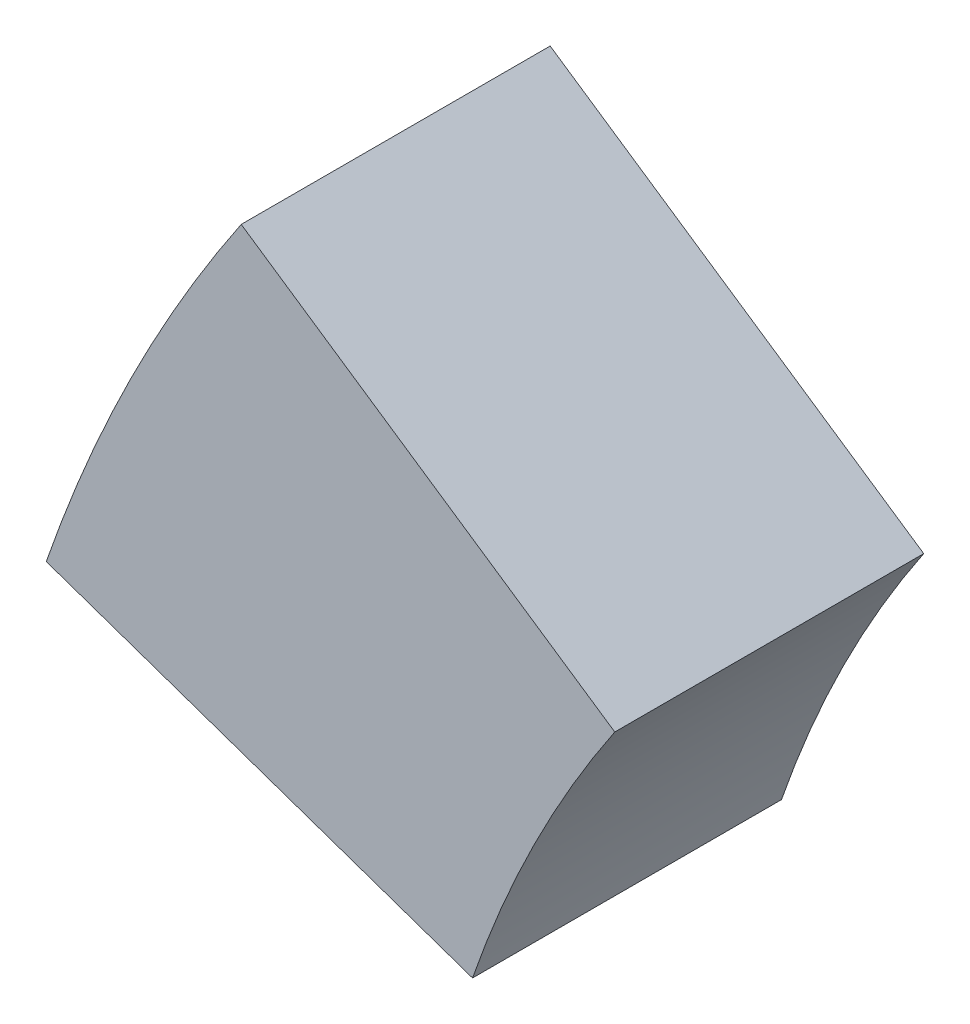
ISO-10303-21;
HEADER;
FILE_DESCRIPTION(('STEP AP214'),'2;1');
FILE_NAME('part.step','',(''),(''),'','','');
FILE_SCHEMA(('AUTOMOTIVE_DESIGN { 1 0 10303 214 1 1 1 1 }'));
ENDSEC;
DATA;
#1=APPLICATION_CONTEXT('core data for automotive mechanical design processes');
#2=APPLICATION_PROTOCOL_DEFINITION('international standard','automotive_design',2000,#1);
#3=PRODUCT_CONTEXT('',#1,'mechanical');
#4=PRODUCT('Part','Part','',(#3));
#5=PRODUCT_RELATED_PRODUCT_CATEGORY('part','',(#4));
#6=PRODUCT_DEFINITION_FORMATION('','',#4);
#7=PRODUCT_DEFINITION_CONTEXT('part definition',#1,'design');
#8=PRODUCT_DEFINITION('design','',#6,#7);
#9=PRODUCT_DEFINITION_SHAPE('','',#8);
#10=(LENGTH_UNIT() NAMED_UNIT(*) SI_UNIT(.MILLI.,.METRE.));
#11=(NAMED_UNIT(*) PLANE_ANGLE_UNIT() SI_UNIT($,.RADIAN.));
#12=(NAMED_UNIT(*) SI_UNIT($,.STERADIAN.) SOLID_ANGLE_UNIT());
#13=UNCERTAINTY_MEASURE_WITH_UNIT(LENGTH_MEASURE(1.E-05),#10,'distance_accuracy_value','');
#14=(GEOMETRIC_REPRESENTATION_CONTEXT(3) GLOBAL_UNCERTAINTY_ASSIGNED_CONTEXT((#13)) GLOBAL_UNIT_ASSIGNED_CONTEXT((#10,
#11,#12)) REPRESENTATION_CONTEXT('',''));
#15=CARTESIAN_POINT('',(0.,0.,0.));
#16=DIRECTION('',(0.,0.,1.));
#17=DIRECTION('',(1.,0.,0.));
#18=AXIS2_PLACEMENT_3D('',#15,#16,#17);
#19=CARTESIAN_POINT('',(0.,0.,50.));
#20=DIRECTION('',(0.,0.,-1.));
#21=DIRECTION('',(-1.,0.,0.));
#22=AXIS2_PLACEMENT_3D('',#19,#20,#21);
#23=CYLINDRICAL_SURFACE('',#22,197.);
#24=CARTESIAN_POINT('',(0.,0.,0.));
#25=DIRECTION('',(0.,0.,-1.));
#26=DIRECTION('',(-1.,0.,0.));
#27=AXIS2_PLACEMENT_3D('',#24,#25,#26);
#28=CIRCLE('',#27,197.);
#29=CARTESIAN_POINT('',(-186.166684544088,64.4279874422743,0.));
#30=VERTEX_POINT('',#29);
#31=CARTESIAN_POINT('',(-163.148018408058,110.416140529924,0.));
#32=VERTEX_POINT('',#31);
#33=EDGE_CURVE('E96',#30,#32,#28,.T.);
#34=ORIENTED_EDGE('',*,*,#33,.T.);
#35=DIRECTION('',(0.,0.,-1.));
#36=VECTOR('',#35,1.);
#37=CARTESIAN_POINT('',(-163.148018408058,110.416140529924,50.));
#38=LINE('',#37,#36);
#39=CARTESIAN_POINT('',(-163.148018408058,110.416140529924,50.));
#40=VERTEX_POINT('',#39);
#41=EDGE_CURVE('E11',#40,#32,#38,.T.);
#42=ORIENTED_EDGE('',*,*,#41,.F.);
#43=CARTESIAN_POINT('',(0.,0.,50.));
#44=DIRECTION('',(0.,0.,-1.));
#45=DIRECTION('',(-1.,0.,0.));
#46=AXIS2_PLACEMENT_3D('',#43,#44,#45);
#47=CIRCLE('',#46,197.);
#48=CARTESIAN_POINT('',(-186.166684544088,64.4279874422743,50.));
#49=VERTEX_POINT('',#48);
#50=EDGE_CURVE('E84',#49,#40,#47,.T.);
#51=ORIENTED_EDGE('',*,*,#50,.F.);
#52=DIRECTION('',(0.,0.,-1.));
#53=VECTOR('',#52,1.);
#54=CARTESIAN_POINT('',(-186.166684544088,64.4279874422743,50.));
#55=LINE('',#54,#53);
#56=EDGE_CURVE('E92',#49,#30,#55,.T.);
#57=ORIENTED_EDGE('',*,*,#56,.T.);
#58=EDGE_LOOP('',(#34,#42,#51,#57));
#59=FACE_BOUND('',#58,.T.);
#60=ADVANCED_FACE('F33',(#59),#23,.F.);
#61=CARTESIAN_POINT('',(-223.603883097339,151.331766208525,50.));
#62=DIRECTION('',(-0.560488022994537,-0.828162529990144,0.));
#63=DIRECTION('',(0.828162529990144,-0.560488022994537,0.));
#64=AXIS2_PLACEMENT_3D('',#61,#62,#63);
#65=PLANE('',#64);
#66=DIRECTION('',(-0.828162529990144,0.560488022994537,0.));
#67=VECTOR('',#66,1.);
#68=CARTESIAN_POINT('',(-223.603883097339,151.331766208525,0.));
#69=LINE('',#68,#67);
#70=CARTESIAN_POINT('',(-223.603883097339,151.331766208525,0.));
#71=VERTEX_POINT('',#70);
#72=EDGE_CURVE('E88',#32,#71,#69,.T.);
#73=ORIENTED_EDGE('',*,*,#72,.T.);
#74=DIRECTION('',(0.,0.,-1.));
#75=VECTOR('',#74,1.);
#76=CARTESIAN_POINT('',(-223.603883097339,151.331766208525,50.));
#77=LINE('',#76,#75);
#78=CARTESIAN_POINT('',(-223.603883097339,151.331766208525,50.));
#79=VERTEX_POINT('',#78);
#80=EDGE_CURVE('E41',#79,#71,#77,.T.);
#81=ORIENTED_EDGE('',*,*,#80,.F.);
#82=DIRECTION('',(-0.828162529990144,0.560488022994537,0.));
#83=VECTOR('',#82,1.);
#84=CARTESIAN_POINT('',(-223.603883097339,151.331766208525,50.));
#85=LINE('',#84,#83);
#86=EDGE_CURVE('E79',#40,#79,#85,.T.);
#87=ORIENTED_EDGE('',*,*,#86,.F.);
#88=ORIENTED_EDGE('',*,*,#41,.T.);
#89=EDGE_LOOP('',(#73,#81,#87,#88));
#90=FACE_BOUND('',#89,.T.);
#91=ADVANCED_FACE('F87',(#90),#65,.F.);
#92=CARTESIAN_POINT('',(0.,0.,50.));
#93=DIRECTION('',(0.,0.,-1.));
#94=DIRECTION('',(-1.,0.,0.));
#95=AXIS2_PLACEMENT_3D('',#92,#93,#94);
#96=CYLINDRICAL_SURFACE('',#95,270.);
#97=CARTESIAN_POINT('',(0.,0.,0.));
#98=DIRECTION('',(0.,0.,1.));
#99=DIRECTION('',(-1.,0.,0.));
#100=AXIS2_PLACEMENT_3D('',#97,#98,#99);
#101=CIRCLE('',#100,270.);
#102=CARTESIAN_POINT('',(-255.15230876601,88.3023178142846,0.));
#103=VERTEX_POINT('',#102);
#104=EDGE_CURVE('E66',#71,#103,#101,.T.);
#105=ORIENTED_EDGE('',*,*,#104,.T.);
#106=DIRECTION('',(0.,0.,-1.));
#107=VECTOR('',#106,1.);
#108=CARTESIAN_POINT('',(-255.15230876601,88.3023178142846,50.));
#109=LINE('',#108,#107);
#110=CARTESIAN_POINT('',(-255.15230876601,88.3023178142846,50.));
#111=VERTEX_POINT('',#110);
#112=EDGE_CURVE('E89',#111,#103,#109,.T.);
#113=ORIENTED_EDGE('',*,*,#112,.F.);
#114=CARTESIAN_POINT('',(0.,0.,50.));
#115=DIRECTION('',(0.,0.,1.));
#116=DIRECTION('',(-1.,0.,0.));
#117=AXIS2_PLACEMENT_3D('',#114,#115,#116);
#118=CIRCLE('',#117,270.);
#119=EDGE_CURVE('E82',#79,#111,#118,.T.);
#120=ORIENTED_EDGE('',*,*,#119,.F.);
#121=ORIENTED_EDGE('',*,*,#80,.T.);
#122=EDGE_LOOP('',(#105,#113,#120,#121));
#123=FACE_BOUND('',#122,.T.);
#124=ADVANCED_FACE('F90',(#123),#96,.T.);
#125=CARTESIAN_POINT('',(-255.15230876601,88.3023178142846,50.));
#126=DIRECTION('',(0.327045621534388,0.945008550985221,0.));
#127=DIRECTION('',(-0.945008550985221,0.327045621534388,0.));
#128=AXIS2_PLACEMENT_3D('',#125,#126,#127);
#129=PLANE('',#128);
#130=DIRECTION('',(0.945008550985221,-0.327045621534388,0.));
#131=VECTOR('',#130,1.);
#132=CARTESIAN_POINT('',(-255.15230876601,88.3023178142846,0.));
#133=LINE('',#132,#131);
#134=EDGE_CURVE('E72',#103,#30,#133,.T.);
#135=ORIENTED_EDGE('',*,*,#134,.T.);
#136=ORIENTED_EDGE('',*,*,#56,.F.);
#137=DIRECTION('',(0.945008550985221,-0.327045621534388,0.));
#138=VECTOR('',#137,1.);
#139=CARTESIAN_POINT('',(-255.15230876601,88.3023178142846,50.));
#140=LINE('',#139,#138);
#141=EDGE_CURVE('E49',#111,#49,#140,.T.);
#142=ORIENTED_EDGE('',*,*,#141,.F.);
#143=ORIENTED_EDGE('',*,*,#112,.T.);
#144=EDGE_LOOP('',(#135,#136,#142,#143));
#145=FACE_BOUND('',#144,.T.);
#146=ADVANCED_FACE('F103',(#145),#129,.F.);
#147=CARTESIAN_POINT('',(0.,0.,50.));
#148=DIRECTION('',(0.,0.,-1.));
#149=DIRECTION('',(-1.,0.,0.));
#150=AXIS2_PLACEMENT_3D('',#147,#148,#149);
#151=PLANE('',#150);
#152=ORIENTED_EDGE('',*,*,#50,.T.);
#153=ORIENTED_EDGE('',*,*,#86,.T.);
#154=ORIENTED_EDGE('',*,*,#119,.T.);
#155=ORIENTED_EDGE('',*,*,#141,.T.);
#156=EDGE_LOOP('',(#152,#153,#154,#155));
#157=FACE_BOUND('',#156,.T.);
#158=ADVANCED_FACE('F80',(#157),#151,.F.);
#159=CARTESIAN_POINT('',(0.,0.,0.));
#160=DIRECTION('',(0.,0.,-1.));
#161=DIRECTION('',(-1.,0.,0.));
#162=AXIS2_PLACEMENT_3D('',#159,#160,#161);
#163=PLANE('',#162);
#164=ORIENTED_EDGE('',*,*,#33,.F.);
#165=ORIENTED_EDGE('',*,*,#134,.F.);
#166=ORIENTED_EDGE('',*,*,#104,.F.);
#167=ORIENTED_EDGE('',*,*,#72,.F.);
#168=EDGE_LOOP('',(#164,#165,#166,#167));
#169=FACE_BOUND('',#168,.T.);
#170=ADVANCED_FACE('F106',(#169),#163,.T.);
#171=CLOSED_SHELL('',(#60,#91,#124,#146,#158,#170));
#172=MANIFOLD_SOLID_BREP('B2',#171);
#173=ADVANCED_BREP_SHAPE_REPRESENTATION('',(#18,#172),#14);
#174=SHAPE_DEFINITION_REPRESENTATION(#9,#173);
ENDSEC;
END-ISO-10303-21;
